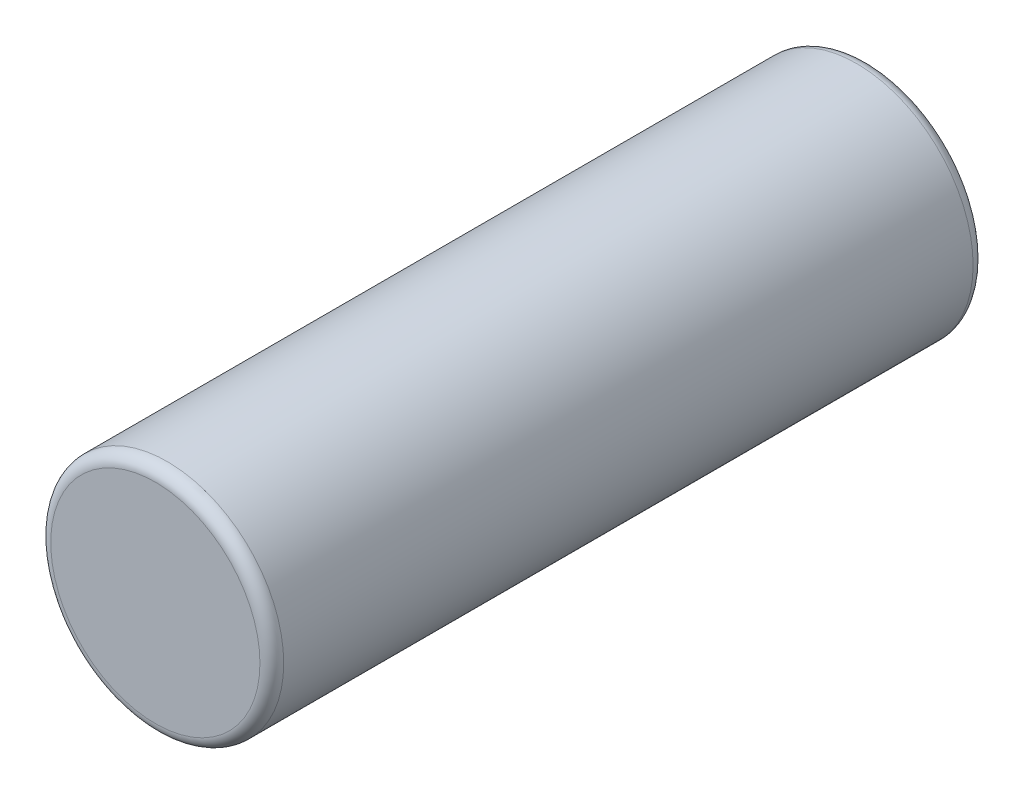
ISO-10303-21;
HEADER;
FILE_DESCRIPTION(('STEP AP214'),'2;1');
FILE_NAME('part.step','',(''),(''),'','','');
FILE_SCHEMA(('AUTOMOTIVE_DESIGN { 1 0 10303 214 1 1 1 1 }'));
ENDSEC;
DATA;
#1=APPLICATION_CONTEXT('core data for automotive mechanical design processes');
#2=APPLICATION_PROTOCOL_DEFINITION('international standard','automotive_design',2000,#1);
#3=PRODUCT_CONTEXT('',#1,'mechanical');
#4=PRODUCT('Part','Part','',(#3));
#5=PRODUCT_RELATED_PRODUCT_CATEGORY('part','',(#4));
#6=PRODUCT_DEFINITION_FORMATION('','',#4);
#7=PRODUCT_DEFINITION_CONTEXT('part definition',#1,'design');
#8=PRODUCT_DEFINITION('design','',#6,#7);
#9=PRODUCT_DEFINITION_SHAPE('','',#8);
#10=(LENGTH_UNIT() NAMED_UNIT(*) SI_UNIT(.MILLI.,.METRE.));
#11=(NAMED_UNIT(*) PLANE_ANGLE_UNIT() SI_UNIT($,.RADIAN.));
#12=(NAMED_UNIT(*) SI_UNIT($,.STERADIAN.) SOLID_ANGLE_UNIT());
#13=UNCERTAINTY_MEASURE_WITH_UNIT(LENGTH_MEASURE(1.E-05),#10,'distance_accuracy_value','');
#14=(GEOMETRIC_REPRESENTATION_CONTEXT(3) GLOBAL_UNCERTAINTY_ASSIGNED_CONTEXT((#13)) GLOBAL_UNIT_ASSIGNED_CONTEXT((#10,
#11,#12)) REPRESENTATION_CONTEXT('',''));
#15=CARTESIAN_POINT('',(0.,0.,0.));
#16=DIRECTION('',(0.,0.,1.));
#17=DIRECTION('',(1.,0.,0.));
#18=AXIS2_PLACEMENT_3D('',#15,#16,#17);
#19=CARTESIAN_POINT('',(0.,0.,15.));
#20=DIRECTION('',(0.,0.,-1.));
#21=DIRECTION('',(-1.,0.,0.));
#22=AXIS2_PLACEMENT_3D('',#19,#20,#21);
#23=CYLINDRICAL_SURFACE('',#22,2.45);
#24=CARTESIAN_POINT('',(0.,0.,14.75));
#25=DIRECTION('',(0.,0.,1.));
#26=DIRECTION('',(1.,0.,0.));
#27=AXIS2_PLACEMENT_3D('',#24,#25,#26);
#28=CIRCLE('',#27,2.45);
#29=CARTESIAN_POINT('',(2.45,0.,14.75));
#30=VERTEX_POINT('',#29);
#31=EDGE_CURVE('E38',#30,#30,#28,.F.);
#32=ORIENTED_EDGE('',*,*,#31,.T.);
#33=EDGE_LOOP('',(#32));
#34=FACE_BOUND('',#33,.T.);
#35=CARTESIAN_POINT('',(0.,0.,0.25));
#36=DIRECTION('',(0.,0.,1.));
#37=DIRECTION('',(1.,0.,0.));
#38=AXIS2_PLACEMENT_3D('',#35,#36,#37);
#39=CIRCLE('',#38,2.45);
#40=CARTESIAN_POINT('',(2.45,0.,0.25));
#41=VERTEX_POINT('',#40);
#42=EDGE_CURVE('E42',#41,#41,#39,.T.);
#43=ORIENTED_EDGE('',*,*,#42,.T.);
#44=EDGE_LOOP('',(#43));
#45=FACE_BOUND('',#44,.T.);
#46=ADVANCED_FACE('F31',(#34,#45),#23,.T.);
#47=CARTESIAN_POINT('',(0.,0.,15.));
#48=DIRECTION('',(0.,0.,1.));
#49=DIRECTION('',(1.,0.,0.));
#50=AXIS2_PLACEMENT_3D('',#47,#48,#49);
#51=PLANE('',#50);
#52=CARTESIAN_POINT('',(0.,0.,15.));
#53=DIRECTION('',(0.,0.,1.));
#54=DIRECTION('',(1.,0.,0.));
#55=AXIS2_PLACEMENT_3D('',#52,#53,#54);
#56=CIRCLE('',#55,2.2);
#57=CARTESIAN_POINT('',(2.2,0.,15.));
#58=VERTEX_POINT('',#57);
#59=EDGE_CURVE('E46',#58,#58,#56,.T.);
#60=ORIENTED_EDGE('',*,*,#59,.T.);
#61=EDGE_LOOP('',(#60));
#62=FACE_BOUND('',#61,.T.);
#63=ADVANCED_FACE('F52',(#62),#51,.T.);
#64=CARTESIAN_POINT('',(0.,0.,0.));
#65=DIRECTION('',(0.,0.,1.));
#66=DIRECTION('',(1.,0.,0.));
#67=AXIS2_PLACEMENT_3D('',#64,#65,#66);
#68=PLANE('',#67);
#69=CARTESIAN_POINT('',(0.,0.,0.));
#70=DIRECTION('',(0.,0.,1.));
#71=DIRECTION('',(1.,0.,0.));
#72=AXIS2_PLACEMENT_3D('',#69,#70,#71);
#73=CIRCLE('',#72,2.2);
#74=CARTESIAN_POINT('',(2.2,0.,0.));
#75=VERTEX_POINT('',#74);
#76=EDGE_CURVE('E10',#75,#75,#73,.F.);
#77=ORIENTED_EDGE('',*,*,#76,.T.);
#78=EDGE_LOOP('',(#77));
#79=FACE_BOUND('',#78,.T.);
#80=ADVANCED_FACE('F56',(#79),#68,.F.);
#81=CARTESIAN_POINT('',(0.,0.,14.75));
#82=DIRECTION('',(0.,0.,1.));
#83=DIRECTION('',(1.,0.,0.));
#84=AXIS2_PLACEMENT_3D('',#81,#82,#83);
#85=TOROIDAL_SURFACE('',#84,2.2,0.25);
#86=ORIENTED_EDGE('',*,*,#31,.F.);
#87=EDGE_LOOP('',(#86));
#88=FACE_BOUND('',#87,.T.);
#89=ORIENTED_EDGE('',*,*,#59,.F.);
#90=EDGE_LOOP('',(#89));
#91=FACE_BOUND('',#90,.T.);
#92=ADVANCED_FACE('F54',(#88,#91),#85,.T.);
#93=CARTESIAN_POINT('',(0.,0.,0.25));
#94=DIRECTION('',(0.,0.,1.));
#95=DIRECTION('',(1.,0.,0.));
#96=AXIS2_PLACEMENT_3D('',#93,#94,#95);
#97=TOROIDAL_SURFACE('',#96,2.2,0.25);
#98=ORIENTED_EDGE('',*,*,#76,.F.);
#99=EDGE_LOOP('',(#98));
#100=FACE_BOUND('',#99,.T.);
#101=ORIENTED_EDGE('',*,*,#42,.F.);
#102=EDGE_LOOP('',(#101));
#103=FACE_BOUND('',#102,.T.);
#104=ADVANCED_FACE('F33',(#100,#103),#97,.T.);
#105=CLOSED_SHELL('',(#46,#63,#80,#92,#104));
#106=MANIFOLD_SOLID_BREP('B2',#105);
#107=ADVANCED_BREP_SHAPE_REPRESENTATION('',(#18,#106),#14);
#108=SHAPE_DEFINITION_REPRESENTATION(#9,#107);
ENDSEC;
END-ISO-10303-21;
